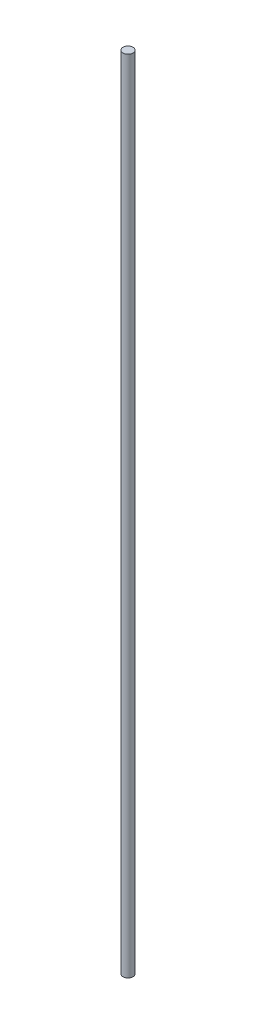
ISO-10303-21;
HEADER;
FILE_DESCRIPTION(('STEP AP214'),'2;1');
FILE_NAME('part.step','',(''),(''),'','','');
FILE_SCHEMA(('AUTOMOTIVE_DESIGN { 1 0 10303 214 1 1 1 1 }'));
ENDSEC;
DATA;
#1=APPLICATION_CONTEXT('core data for automotive mechanical design processes');
#2=APPLICATION_PROTOCOL_DEFINITION('international standard','automotive_design',2000,#1);
#3=PRODUCT_CONTEXT('',#1,'mechanical');
#4=PRODUCT('Part','Part','',(#3));
#5=PRODUCT_RELATED_PRODUCT_CATEGORY('part','',(#4));
#6=PRODUCT_DEFINITION_FORMATION('','',#4);
#7=PRODUCT_DEFINITION_CONTEXT('part definition',#1,'design');
#8=PRODUCT_DEFINITION('design','',#6,#7);
#9=PRODUCT_DEFINITION_SHAPE('','',#8);
#10=(LENGTH_UNIT() NAMED_UNIT(*) SI_UNIT(.MILLI.,.METRE.));
#11=(NAMED_UNIT(*) PLANE_ANGLE_UNIT() SI_UNIT($,.RADIAN.));
#12=(NAMED_UNIT(*) SI_UNIT($,.STERADIAN.) SOLID_ANGLE_UNIT());
#13=UNCERTAINTY_MEASURE_WITH_UNIT(LENGTH_MEASURE(1.E-05),#10,'distance_accuracy_value','');
#14=(GEOMETRIC_REPRESENTATION_CONTEXT(3) GLOBAL_UNCERTAINTY_ASSIGNED_CONTEXT((#13)) GLOBAL_UNIT_ASSIGNED_CONTEXT((#10,
#11,#12)) REPRESENTATION_CONTEXT('',''));
#15=CARTESIAN_POINT('',(0.,0.,0.));
#16=DIRECTION('',(0.,0.,1.));
#17=DIRECTION('',(1.,0.,0.));
#18=AXIS2_PLACEMENT_3D('',#15,#16,#17);
#19=CARTESIAN_POINT('',(0.,635.,0.));
#20=DIRECTION('',(0.,-1.,0.));
#21=DIRECTION('',(0.,0.,-1.));
#22=AXIS2_PLACEMENT_3D('',#19,#20,#21);
#23=CYLINDRICAL_SURFACE('',#22,4.);
#24=CARTESIAN_POINT('',(0.,635.,0.));
#25=DIRECTION('',(0.,1.,0.));
#26=DIRECTION('',(0.,0.,1.));
#27=AXIS2_PLACEMENT_3D('',#24,#25,#26);
#28=CIRCLE('',#27,4.);
#29=CARTESIAN_POINT('',(0.,635.,-4.));
#30=VERTEX_POINT('',#29);
#31=EDGE_CURVE('E10',#30,#30,#28,.T.);
#32=CARTESIAN_POINT('',(0.,0.,0.));
#33=DIRECTION('',(0.,1.,0.));
#34=DIRECTION('',(0.,0.,1.));
#35=AXIS2_PLACEMENT_3D('',#32,#33,#34);
#36=CIRCLE('',#35,4.);
#37=CARTESIAN_POINT('',(0.,-1.11022302462516E-13,-4.));
#38=VERTEX_POINT('',#37);
#39=EDGE_CURVE('E32',#38,#38,#36,.T.);
#40=CARTESIAN_POINT('',(0.,635.,-4.));
#41=CARTESIAN_POINT('',(0.,628.385416666667,-4.));
#42=CARTESIAN_POINT('',(0.,621.770833333333,-4.));
#43=CARTESIAN_POINT('',(0.,608.541666666667,-4.));
#44=CARTESIAN_POINT('',(0.,601.927083333333,-4.));
#45=CARTESIAN_POINT('',(0.,588.697916666667,-4.));
#46=CARTESIAN_POINT('',(0.,582.083333333333,-4.));
#47=CARTESIAN_POINT('',(0.,568.854166666667,-4.));
#48=CARTESIAN_POINT('',(0.,562.239583333333,-4.));
#49=CARTESIAN_POINT('',(0.,549.010416666667,-4.));
#50=CARTESIAN_POINT('',(0.,542.395833333333,-4.));
#51=CARTESIAN_POINT('',(0.,529.166666666667,-4.));
#52=CARTESIAN_POINT('',(0.,522.552083333333,-4.));
#53=CARTESIAN_POINT('',(0.,509.322916666667,-4.));
#54=CARTESIAN_POINT('',(0.,502.708333333333,-4.));
#55=CARTESIAN_POINT('',(0.,489.479166666667,-4.));
#56=CARTESIAN_POINT('',(0.,482.864583333333,-4.));
#57=CARTESIAN_POINT('',(0.,469.635416666667,-4.));
#58=CARTESIAN_POINT('',(0.,463.020833333333,-4.));
#59=CARTESIAN_POINT('',(0.,449.791666666667,-4.));
#60=CARTESIAN_POINT('',(0.,443.177083333333,-4.));
#61=CARTESIAN_POINT('',(0.,429.947916666667,-4.));
#62=CARTESIAN_POINT('',(0.,423.333333333333,-4.));
#63=CARTESIAN_POINT('',(0.,410.104166666667,-4.));
#64=CARTESIAN_POINT('',(0.,403.489583333333,-4.));
#65=CARTESIAN_POINT('',(0.,390.260416666667,-4.));
#66=CARTESIAN_POINT('',(0.,383.645833333333,-4.));
#67=CARTESIAN_POINT('',(0.,370.416666666667,-4.));
#68=CARTESIAN_POINT('',(0.,363.802083333333,-4.));
#69=CARTESIAN_POINT('',(0.,350.572916666667,-4.));
#70=CARTESIAN_POINT('',(0.,343.958333333333,-4.));
#71=CARTESIAN_POINT('',(0.,330.729166666667,-4.));
#72=CARTESIAN_POINT('',(0.,324.114583333333,-4.));
#73=CARTESIAN_POINT('',(0.,310.885416666667,-4.));
#74=CARTESIAN_POINT('',(0.,304.270833333333,-4.));
#75=CARTESIAN_POINT('',(0.,291.041666666667,-4.));
#76=CARTESIAN_POINT('',(0.,284.427083333333,-4.));
#77=CARTESIAN_POINT('',(0.,271.197916666667,-4.));
#78=CARTESIAN_POINT('',(0.,264.583333333333,-4.));
#79=CARTESIAN_POINT('',(0.,251.354166666667,-4.));
#80=CARTESIAN_POINT('',(0.,244.739583333333,-4.));
#81=CARTESIAN_POINT('',(0.,231.510416666667,-4.));
#82=CARTESIAN_POINT('',(0.,224.895833333333,-4.));
#83=CARTESIAN_POINT('',(0.,211.666666666667,-4.));
#84=CARTESIAN_POINT('',(0.,205.052083333333,-4.));
#85=CARTESIAN_POINT('',(0.,191.822916666666,-4.));
#86=CARTESIAN_POINT('',(0.,185.208333333333,-4.));
#87=CARTESIAN_POINT('',(0.,171.979166666666,-4.));
#88=CARTESIAN_POINT('',(0.,165.364583333333,-4.));
#89=CARTESIAN_POINT('',(0.,152.135416666666,-4.));
#90=CARTESIAN_POINT('',(0.,145.520833333333,-4.));
#91=CARTESIAN_POINT('',(0.,132.291666666667,-4.));
#92=CARTESIAN_POINT('',(0.,125.677083333333,-4.));
#93=CARTESIAN_POINT('',(0.,112.447916666667,-4.));
#94=CARTESIAN_POINT('',(0.,105.833333333333,-4.));
#95=CARTESIAN_POINT('',(0.,92.6041666666666,-4.));
#96=CARTESIAN_POINT('',(0.,85.9895833333332,-4.));
#97=CARTESIAN_POINT('',(0.,72.7604166666665,-4.));
#98=CARTESIAN_POINT('',(0.,66.1458333333332,-4.));
#99=CARTESIAN_POINT('',(0.,52.9166666666666,-4.));
#100=CARTESIAN_POINT('',(0.,46.3020833333332,-4.));
#101=CARTESIAN_POINT('',(0.,33.0729166666666,-4.));
#102=CARTESIAN_POINT('',(0.,26.4583333333333,-4.));
#103=CARTESIAN_POINT('',(0.,13.2291666666666,-4.));
#104=CARTESIAN_POINT('',(0.,6.61458333333324,-4.));
#105=CARTESIAN_POINT('',(0.,-1.11022302462516E-13,-4.));
#106=B_SPLINE_CURVE_WITH_KNOTS('',3,(#40,#41,#42,#43,#44,#45,#46,#47,#48,#49,#50,#51,#52,#53,
#54,#55,#56,#57,#58,#59,#60,#61,#62,#63,#64,#65,#66,#67,#68,#69,#70,#71,#72,#73,#74,#75,#76,#77,
#78,#79,#80,#81,#82,#83,#84,#85,#86,#87,#88,#89,#90,#91,#92,#93,#94,#95,#96,#97,#98,#99,#100,
#101,#102,#103,#104,#105),.UNSPECIFIED.,.F.,.F.,(4,2,2,2,2,2,2,2,2,2,2,2,2,2,2,2,2,2,2,2,2,2,2,
2,2,2,2,2,2,2,2,2,4),(0.,19.84375,39.6875000000001,59.53125,79.3750000000001,99.2187500000001,
119.0625,138.90625,158.75,178.59375,198.4375,218.28125,238.125,257.96875,277.8125,297.65625,
317.5,337.34375,357.1875,377.03125,396.875,416.71875,436.5625,456.40625,476.25,496.09375,
515.9375,535.78125,555.625,575.46875,595.3125,615.15625,635.),.UNSPECIFIED.);
#107=EDGE_CURVE('BSEAM29',#30,#38,#106,.T.);
#108=ORIENTED_EDGE('',*,*,#31,.F.);
#109=ORIENTED_EDGE('',*,*,#39,.T.);
#110=ORIENTED_EDGE('',*,*,#107,.T.);
#111=ORIENTED_EDGE('',*,*,#107,.F.);
#112=EDGE_LOOP('',(#108,#110,#109,#111));
#113=FACE_BOUND('',#112,.T.);
#114=ADVANCED_FACE('F29',(#113),#23,.T.);
#115=CARTESIAN_POINT('',(0.,635.,0.));
#116=DIRECTION('',(0.,1.,0.));
#117=DIRECTION('',(0.,0.,1.));
#118=AXIS2_PLACEMENT_3D('',#115,#116,#117);
#119=PLANE('',#118);
#120=ORIENTED_EDGE('',*,*,#31,.T.);
#121=EDGE_LOOP('',(#120));
#122=FACE_BOUND('',#121,.T.);
#123=ADVANCED_FACE('F44',(#122),#119,.T.);
#124=CARTESIAN_POINT('',(0.,0.,0.));
#125=DIRECTION('',(0.,1.,0.));
#126=DIRECTION('',(0.,0.,1.));
#127=AXIS2_PLACEMENT_3D('',#124,#125,#126);
#128=PLANE('',#127);
#129=ORIENTED_EDGE('',*,*,#39,.F.);
#130=EDGE_LOOP('',(#129));
#131=FACE_BOUND('',#130,.T.);
#132=ADVANCED_FACE('F42',(#131),#128,.F.);
#133=CLOSED_SHELL('',(#114,#123,#132));
#134=MANIFOLD_SOLID_BREP('B2',#133);
#135=ADVANCED_BREP_SHAPE_REPRESENTATION('',(#18,#134),#14);
#136=SHAPE_DEFINITION_REPRESENTATION(#9,#135);
ENDSEC;
END-ISO-10303-21;
